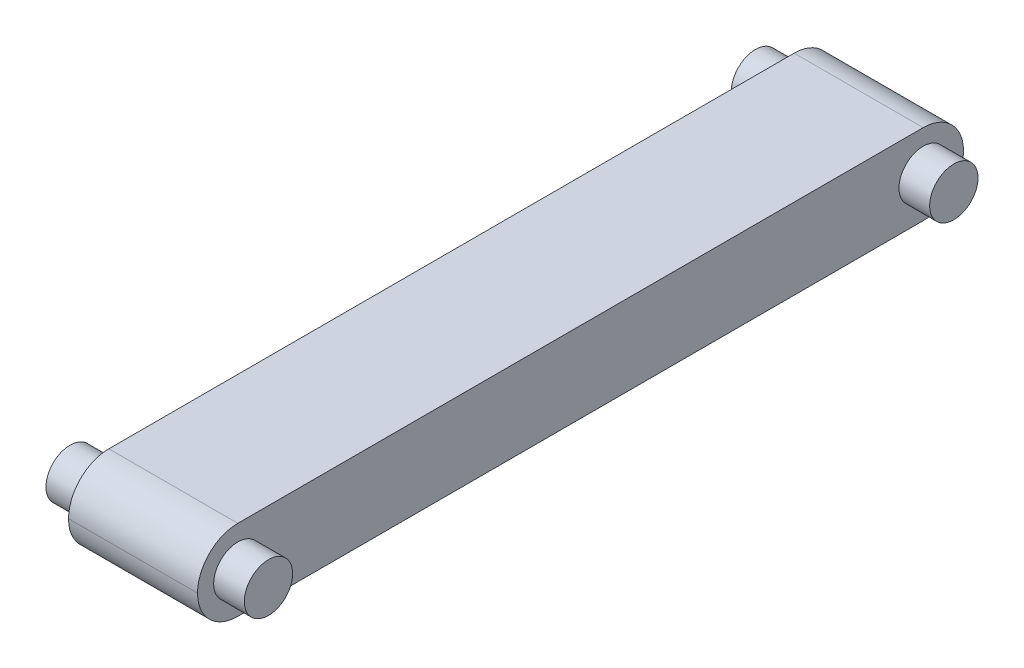
ISO-10303-21;
HEADER;
FILE_DESCRIPTION(('STEP AP214'),'2;1');
FILE_NAME('part.step','',(''),(''),'','','');
FILE_SCHEMA(('AUTOMOTIVE_DESIGN { 1 0 10303 214 1 1 1 1 }'));
ENDSEC;
DATA;
#1=APPLICATION_CONTEXT('core data for automotive mechanical design processes');
#2=APPLICATION_PROTOCOL_DEFINITION('international standard','automotive_design',2000,#1);
#3=PRODUCT_CONTEXT('',#1,'mechanical');
#4=PRODUCT('Part','Part','',(#3));
#5=PRODUCT_RELATED_PRODUCT_CATEGORY('part','',(#4));
#6=PRODUCT_DEFINITION_FORMATION('','',#4);
#7=PRODUCT_DEFINITION_CONTEXT('part definition',#1,'design');
#8=PRODUCT_DEFINITION('design','',#6,#7);
#9=PRODUCT_DEFINITION_SHAPE('','',#8);
#10=(LENGTH_UNIT() NAMED_UNIT(*) SI_UNIT(.MILLI.,.METRE.));
#11=(NAMED_UNIT(*) PLANE_ANGLE_UNIT() SI_UNIT($,.RADIAN.));
#12=(NAMED_UNIT(*) SI_UNIT($,.STERADIAN.) SOLID_ANGLE_UNIT());
#13=UNCERTAINTY_MEASURE_WITH_UNIT(LENGTH_MEASURE(1.E-05),#10,'distance_accuracy_value','');
#14=(GEOMETRIC_REPRESENTATION_CONTEXT(3) GLOBAL_UNCERTAINTY_ASSIGNED_CONTEXT((#13)) GLOBAL_UNIT_ASSIGNED_CONTEXT((#10,
#11,#12)) REPRESENTATION_CONTEXT('',''));
#15=CARTESIAN_POINT('',(0.,0.,0.));
#16=DIRECTION('',(0.,0.,1.));
#17=DIRECTION('',(1.,0.,0.));
#18=AXIS2_PLACEMENT_3D('',#15,#16,#17);
#19=CARTESIAN_POINT('',(0.,5.,0.));
#20=DIRECTION('',(1.,0.,0.));
#21=DIRECTION('',(0.,0.,-1.));
#22=AXIS2_PLACEMENT_3D('',#19,#20,#21);
#23=PLANE('',#22);
#24=CARTESIAN_POINT('',(0.,2.5,-45.));
#25=DIRECTION('',(1.,0.,0.));
#26=DIRECTION('',(0.,0.,-1.));
#27=AXIS2_PLACEMENT_3D('',#24,#25,#26);
#28=CIRCLE('',#27,1.5);
#29=CARTESIAN_POINT('',(0.,2.5,-46.5));
#30=VERTEX_POINT('',#29);
#31=EDGE_CURVE('E147',#30,#30,#28,.T.);
#32=ORIENTED_EDGE('',*,*,#31,.T.);
#33=EDGE_LOOP('',(#32));
#34=FACE_BOUND('',#33,.T.);
#35=CARTESIAN_POINT('',(0.,2.5,-2.5));
#36=DIRECTION('',(1.,0.,0.));
#37=DIRECTION('',(0.,0.,-1.));
#38=AXIS2_PLACEMENT_3D('',#35,#36,#37);
#39=CIRCLE('',#38,1.5);
#40=CARTESIAN_POINT('',(0.,2.5,-4.));
#41=VERTEX_POINT('',#40);
#42=EDGE_CURVE('E110',#41,#41,#39,.T.);
#43=ORIENTED_EDGE('',*,*,#42,.T.);
#44=EDGE_LOOP('',(#43));
#45=FACE_BOUND('',#44,.T.);
#46=CARTESIAN_POINT('',(0.,2.5,-45.));
#47=DIRECTION('',(1.,0.,0.));
#48=DIRECTION('',(0.,0.,-1.));
#49=AXIS2_PLACEMENT_3D('',#46,#47,#48);
#50=CIRCLE('',#49,2.5);
#51=CARTESIAN_POINT('',(0.,5.,-45.));
#52=VERTEX_POINT('',#51);
#53=CARTESIAN_POINT('',(0.,2.5,-47.5));
#54=VERTEX_POINT('',#53);
#55=EDGE_CURVE('E94',#52,#54,#50,.F.);
#56=ORIENTED_EDGE('',*,*,#55,.T.);
#57=CARTESIAN_POINT('',(0.,2.5,-45.));
#58=DIRECTION('',(1.,0.,0.));
#59=DIRECTION('',(0.,0.,-1.));
#60=AXIS2_PLACEMENT_3D('',#57,#58,#59);
#61=CIRCLE('',#60,2.5);
#62=CARTESIAN_POINT('',(0.,0.,-45.));
#63=VERTEX_POINT('',#62);
#64=EDGE_CURVE('E89',#54,#63,#61,.F.);
#65=ORIENTED_EDGE('',*,*,#64,.T.);
#66=DIRECTION('',(0.,0.,1.));
#67=VECTOR('',#66,1.);
#68=CARTESIAN_POINT('',(0.,0.,0.));
#69=LINE('',#68,#67);
#70=CARTESIAN_POINT('',(0.,0.,-2.5));
#71=VERTEX_POINT('',#70);
#72=EDGE_CURVE('E91',#63,#71,#69,.T.);
#73=ORIENTED_EDGE('',*,*,#72,.T.);
#74=CARTESIAN_POINT('',(0.,2.5,-2.5));
#75=DIRECTION('',(1.,0.,0.));
#76=DIRECTION('',(0.,0.,-1.));
#77=AXIS2_PLACEMENT_3D('',#74,#75,#76);
#78=CIRCLE('',#77,2.5);
#79=CARTESIAN_POINT('',(0.,2.5,0.));
#80=VERTEX_POINT('',#79);
#81=EDGE_CURVE('E131',#71,#80,#78,.F.);
#82=ORIENTED_EDGE('',*,*,#81,.T.);
#83=CARTESIAN_POINT('',(0.,2.5,-2.5));
#84=DIRECTION('',(1.,0.,0.));
#85=DIRECTION('',(0.,0.,-1.));
#86=AXIS2_PLACEMENT_3D('',#83,#84,#85);
#87=CIRCLE('',#86,2.5);
#88=CARTESIAN_POINT('',(0.,5.,-2.5));
#89=VERTEX_POINT('',#88);
#90=EDGE_CURVE('E135',#80,#89,#87,.F.);
#91=ORIENTED_EDGE('',*,*,#90,.T.);
#92=DIRECTION('',(0.,0.,1.));
#93=VECTOR('',#92,1.);
#94=CARTESIAN_POINT('',(0.,5.,0.));
#95=LINE('',#94,#93);
#96=EDGE_CURVE('E140',#52,#89,#95,.T.);
#97=ORIENTED_EDGE('',*,*,#96,.F.);
#98=EDGE_LOOP('',(#56,#65,#73,#82,#91,#97));
#99=FACE_BOUND('',#98,.T.);
#100=ADVANCED_FACE('F35',(#34,#45,#99),#23,.F.);
#101=CARTESIAN_POINT('',(8.,5.,0.));
#102=DIRECTION('',(-1.,0.,0.));
#103=DIRECTION('',(0.,0.,1.));
#104=AXIS2_PLACEMENT_3D('',#101,#102,#103);
#105=PLANE('',#104);
#106=CARTESIAN_POINT('',(8.,2.5,-45.));
#107=DIRECTION('',(-1.,0.,0.));
#108=DIRECTION('',(0.,0.,1.));
#109=AXIS2_PLACEMENT_3D('',#106,#107,#108);
#110=CIRCLE('',#109,1.5);
#111=CARTESIAN_POINT('',(8.,2.5,-43.5));
#112=VERTEX_POINT('',#111);
#113=EDGE_CURVE('E143',#112,#112,#110,.T.);
#114=ORIENTED_EDGE('',*,*,#113,.T.);
#115=EDGE_LOOP('',(#114));
#116=FACE_BOUND('',#115,.T.);
#117=CARTESIAN_POINT('',(8.,2.5,-2.5));
#118=DIRECTION('',(-1.,0.,0.));
#119=DIRECTION('',(0.,0.,1.));
#120=AXIS2_PLACEMENT_3D('',#117,#118,#119);
#121=CIRCLE('',#120,1.5);
#122=CARTESIAN_POINT('',(8.,2.5,-1.));
#123=VERTEX_POINT('',#122);
#124=EDGE_CURVE('E148',#123,#123,#121,.T.);
#125=ORIENTED_EDGE('',*,*,#124,.T.);
#126=EDGE_LOOP('',(#125));
#127=FACE_BOUND('',#126,.T.);
#128=DIRECTION('',(0.,0.,-1.));
#129=VECTOR('',#128,1.);
#130=CARTESIAN_POINT('',(8.,0.,0.));
#131=LINE('',#130,#129);
#132=CARTESIAN_POINT('',(8.,0.,-2.5));
#133=VERTEX_POINT('',#132);
#134=CARTESIAN_POINT('',(8.,0.,-45.));
#135=VERTEX_POINT('',#134);
#136=EDGE_CURVE('E109',#133,#135,#131,.T.);
#137=ORIENTED_EDGE('',*,*,#136,.T.);
#138=CARTESIAN_POINT('',(8.,2.5,-45.));
#139=DIRECTION('',(-1.,0.,0.));
#140=DIRECTION('',(0.,0.,1.));
#141=AXIS2_PLACEMENT_3D('',#138,#139,#140);
#142=CIRCLE('',#141,2.5);
#143=CARTESIAN_POINT('',(8.,2.5,-47.5));
#144=VERTEX_POINT('',#143);
#145=EDGE_CURVE('E113',#135,#144,#142,.F.);
#146=ORIENTED_EDGE('',*,*,#145,.T.);
#147=CARTESIAN_POINT('',(8.,2.5,-45.));
#148=DIRECTION('',(-1.,0.,0.));
#149=DIRECTION('',(0.,0.,1.));
#150=AXIS2_PLACEMENT_3D('',#147,#148,#149);
#151=CIRCLE('',#150,2.5);
#152=CARTESIAN_POINT('',(8.,5.,-45.));
#153=VERTEX_POINT('',#152);
#154=EDGE_CURVE('E58',#144,#153,#151,.F.);
#155=ORIENTED_EDGE('',*,*,#154,.T.);
#156=DIRECTION('',(0.,0.,-1.));
#157=VECTOR('',#156,1.);
#158=CARTESIAN_POINT('',(8.,5.,0.));
#159=LINE('',#158,#157);
#160=CARTESIAN_POINT('',(8.,5.,-2.5));
#161=VERTEX_POINT('',#160);
#162=EDGE_CURVE('E137',#161,#153,#159,.T.);
#163=ORIENTED_EDGE('',*,*,#162,.F.);
#164=CARTESIAN_POINT('',(8.,2.5,-2.5));
#165=DIRECTION('',(-1.,0.,0.));
#166=DIRECTION('',(0.,0.,1.));
#167=AXIS2_PLACEMENT_3D('',#164,#165,#166);
#168=CIRCLE('',#167,2.5);
#169=CARTESIAN_POINT('',(8.,2.5,0.));
#170=VERTEX_POINT('',#169);
#171=EDGE_CURVE('E52',#161,#170,#168,.F.);
#172=ORIENTED_EDGE('',*,*,#171,.T.);
#173=CARTESIAN_POINT('',(8.,2.5,-2.5));
#174=DIRECTION('',(-1.,0.,0.));
#175=DIRECTION('',(0.,0.,1.));
#176=AXIS2_PLACEMENT_3D('',#173,#174,#175);
#177=CIRCLE('',#176,2.5);
#178=EDGE_CURVE('E115',#170,#133,#177,.F.);
#179=ORIENTED_EDGE('',*,*,#178,.T.);
#180=EDGE_LOOP('',(#137,#146,#155,#163,#172,#179));
#181=FACE_BOUND('',#180,.T.);
#182=ADVANCED_FACE('F183',(#116,#127,#181),#105,.F.);
#183=CARTESIAN_POINT('',(0.,5.,0.));
#184=DIRECTION('',(0.,-1.,0.));
#185=DIRECTION('',(0.,0.,-1.));
#186=AXIS2_PLACEMENT_3D('',#183,#184,#185);
#187=PLANE('',#186);
#188=ORIENTED_EDGE('',*,*,#162,.T.);
#189=DIRECTION('',(-1.,0.,0.));
#190=VECTOR('',#189,1.);
#191=CARTESIAN_POINT('',(0.,5.,-45.));
#192=LINE('',#191,#190);
#193=EDGE_CURVE('E11',#153,#52,#192,.T.);
#194=ORIENTED_EDGE('',*,*,#193,.T.);
#195=ORIENTED_EDGE('',*,*,#96,.T.);
#196=DIRECTION('',(1.,0.,0.));
#197=VECTOR('',#196,1.);
#198=CARTESIAN_POINT('',(0.,5.,-2.5));
#199=LINE('',#198,#197);
#200=EDGE_CURVE('E44',#89,#161,#199,.T.);
#201=ORIENTED_EDGE('',*,*,#200,.T.);
#202=EDGE_LOOP('',(#188,#194,#195,#201));
#203=FACE_BOUND('',#202,.T.);
#204=ADVANCED_FACE('F189',(#203),#187,.F.);
#205=CARTESIAN_POINT('',(0.,0.,0.));
#206=DIRECTION('',(0.,-1.,0.));
#207=DIRECTION('',(0.,0.,-1.));
#208=AXIS2_PLACEMENT_3D('',#205,#206,#207);
#209=PLANE('',#208);
#210=ORIENTED_EDGE('',*,*,#72,.F.);
#211=DIRECTION('',(-1.,0.,0.));
#212=VECTOR('',#211,1.);
#213=CARTESIAN_POINT('',(8.,0.,-45.));
#214=LINE('',#213,#212);
#215=EDGE_CURVE('E106',#63,#135,#214,.F.);
#216=ORIENTED_EDGE('',*,*,#215,.T.);
#217=ORIENTED_EDGE('',*,*,#136,.F.);
#218=DIRECTION('',(1.,0.,0.));
#219=VECTOR('',#218,1.);
#220=CARTESIAN_POINT('',(0.,0.,-2.5));
#221=LINE('',#220,#219);
#222=EDGE_CURVE('E99',#133,#71,#221,.F.);
#223=ORIENTED_EDGE('',*,*,#222,.T.);
#224=EDGE_LOOP('',(#210,#216,#217,#223));
#225=FACE_BOUND('',#224,.T.);
#226=ADVANCED_FACE('F104',(#225),#209,.T.);
#227=CARTESIAN_POINT('',(9.9,2.5,-2.5));
#228=DIRECTION('',(1.,0.,0.));
#229=DIRECTION('',(0.,0.,-1.));
#230=AXIS2_PLACEMENT_3D('',#227,#228,#229);
#231=PLANE('',#230);
#232=CARTESIAN_POINT('',(9.9,2.5,-2.5));
#233=DIRECTION('',(1.,0.,0.));
#234=DIRECTION('',(0.,0.,-1.));
#235=AXIS2_PLACEMENT_3D('',#232,#233,#234);
#236=CIRCLE('',#235,1.5);
#237=CARTESIAN_POINT('',(9.9,2.5,-4.));
#238=VERTEX_POINT('',#237);
#239=EDGE_CURVE('E158',#238,#238,#236,.T.);
#240=ORIENTED_EDGE('',*,*,#239,.T.);
#241=EDGE_LOOP('',(#240));
#242=FACE_BOUND('',#241,.T.);
#243=ADVANCED_FACE('F220',(#242),#231,.T.);
#244=CARTESIAN_POINT('',(-2.4,2.5,-2.5));
#245=DIRECTION('',(1.,0.,0.));
#246=DIRECTION('',(0.,0.,-1.));
#247=AXIS2_PLACEMENT_3D('',#244,#245,#246);
#248=CYLINDRICAL_SURFACE('',#247,1.5);
#249=ORIENTED_EDGE('',*,*,#239,.F.);
#250=EDGE_LOOP('',(#249));
#251=FACE_BOUND('',#250,.T.);
#252=ORIENTED_EDGE('',*,*,#124,.F.);
#253=EDGE_LOOP('',(#252));
#254=FACE_BOUND('',#253,.T.);
#255=ADVANCED_FACE('F286',(#251,#254),#248,.T.);
#256=CARTESIAN_POINT('',(-2.4,2.5,-2.5));
#257=DIRECTION('',(1.,0.,0.));
#258=DIRECTION('',(0.,0.,-1.));
#259=AXIS2_PLACEMENT_3D('',#256,#257,#258);
#260=CIRCLE('',#259,1.5);
#261=CARTESIAN_POINT('',(-2.4,2.5,-4.));
#262=VERTEX_POINT('',#261);
#263=EDGE_CURVE('E151',#262,#262,#260,.T.);
#264=ORIENTED_EDGE('',*,*,#263,.T.);
#265=EDGE_LOOP('',(#264));
#266=FACE_BOUND('',#265,.T.);
#267=ORIENTED_EDGE('',*,*,#42,.F.);
#268=EDGE_LOOP('',(#267));
#269=FACE_BOUND('',#268,.T.);
#270=ADVANCED_FACE('F276',(#266,#269),#248,.T.);
#271=CARTESIAN_POINT('',(-2.4,2.5,-2.5));
#272=DIRECTION('',(1.,0.,0.));
#273=DIRECTION('',(0.,0.,-1.));
#274=AXIS2_PLACEMENT_3D('',#271,#272,#273);
#275=PLANE('',#274);
#276=ORIENTED_EDGE('',*,*,#263,.F.);
#277=EDGE_LOOP('',(#276));
#278=FACE_BOUND('',#277,.T.);
#279=ADVANCED_FACE('F267',(#278),#275,.F.);
#280=CARTESIAN_POINT('',(9.9,2.5,-45.));
#281=DIRECTION('',(1.,0.,0.));
#282=DIRECTION('',(0.,0.,-1.));
#283=AXIS2_PLACEMENT_3D('',#280,#281,#282);
#284=PLANE('',#283);
#285=CARTESIAN_POINT('',(9.9,2.5,-45.));
#286=DIRECTION('',(1.,0.,0.));
#287=DIRECTION('',(0.,0.,-1.));
#288=AXIS2_PLACEMENT_3D('',#285,#286,#287);
#289=CIRCLE('',#288,1.5);
#290=CARTESIAN_POINT('',(9.9,2.5,-46.5));
#291=VERTEX_POINT('',#290);
#292=EDGE_CURVE('E123',#291,#291,#289,.T.);
#293=ORIENTED_EDGE('',*,*,#292,.T.);
#294=EDGE_LOOP('',(#293));
#295=FACE_BOUND('',#294,.T.);
#296=ADVANCED_FACE('F258',(#295),#284,.T.);
#297=CARTESIAN_POINT('',(-2.4,2.5,-45.));
#298=DIRECTION('',(1.,0.,0.));
#299=DIRECTION('',(0.,0.,-1.));
#300=AXIS2_PLACEMENT_3D('',#297,#298,#299);
#301=CYLINDRICAL_SURFACE('',#300,1.5);
#302=ORIENTED_EDGE('',*,*,#292,.F.);
#303=EDGE_LOOP('',(#302));
#304=FACE_BOUND('',#303,.T.);
#305=ORIENTED_EDGE('',*,*,#113,.F.);
#306=EDGE_LOOP('',(#305));
#307=FACE_BOUND('',#306,.T.);
#308=ADVANCED_FACE('F179',(#304,#307),#301,.T.);
#309=CARTESIAN_POINT('',(-2.4,2.5,-45.));
#310=DIRECTION('',(1.,0.,0.));
#311=DIRECTION('',(0.,0.,-1.));
#312=AXIS2_PLACEMENT_3D('',#309,#310,#311);
#313=CIRCLE('',#312,1.5);
#314=CARTESIAN_POINT('',(-2.4,2.5,-46.5));
#315=VERTEX_POINT('',#314);
#316=EDGE_CURVE('E125',#315,#315,#313,.T.);
#317=ORIENTED_EDGE('',*,*,#316,.T.);
#318=EDGE_LOOP('',(#317));
#319=FACE_BOUND('',#318,.T.);
#320=ORIENTED_EDGE('',*,*,#31,.F.);
#321=EDGE_LOOP('',(#320));
#322=FACE_BOUND('',#321,.T.);
#323=ADVANCED_FACE('F166',(#319,#322),#301,.T.);
#324=CARTESIAN_POINT('',(-2.4,2.5,-45.));
#325=DIRECTION('',(1.,0.,0.));
#326=DIRECTION('',(0.,0.,-1.));
#327=AXIS2_PLACEMENT_3D('',#324,#325,#326);
#328=PLANE('',#327);
#329=ORIENTED_EDGE('',*,*,#316,.F.);
#330=EDGE_LOOP('',(#329));
#331=FACE_BOUND('',#330,.T.);
#332=ADVANCED_FACE('F169',(#331),#328,.F.);
#333=CARTESIAN_POINT('',(0.,2.5,-45.));
#334=DIRECTION('',(-1.,0.,0.));
#335=DIRECTION('',(0.,0.,1.));
#336=AXIS2_PLACEMENT_3D('',#333,#334,#335);
#337=CYLINDRICAL_SURFACE('',#336,2.5);
#338=ORIENTED_EDGE('',*,*,#193,.F.);
#339=ORIENTED_EDGE('',*,*,#154,.F.);
#340=DIRECTION('',(-1.,0.,0.));
#341=VECTOR('',#340,1.);
#342=CARTESIAN_POINT('',(0.,2.5,-47.5));
#343=LINE('',#342,#341);
#344=EDGE_CURVE('E122',#54,#144,#343,.F.);
#345=ORIENTED_EDGE('',*,*,#344,.F.);
#346=ORIENTED_EDGE('',*,*,#55,.F.);
#347=EDGE_LOOP('',(#338,#339,#345,#346));
#348=FACE_BOUND('',#347,.T.);
#349=ADVANCED_FACE('F171',(#348),#337,.T.);
#350=CARTESIAN_POINT('',(0.,2.5,-45.));
#351=DIRECTION('',(1.,0.,0.));
#352=DIRECTION('',(0.,0.,-1.));
#353=AXIS2_PLACEMENT_3D('',#350,#351,#352);
#354=CYLINDRICAL_SURFACE('',#353,2.5);
#355=ORIENTED_EDGE('',*,*,#145,.F.);
#356=ORIENTED_EDGE('',*,*,#215,.F.);
#357=ORIENTED_EDGE('',*,*,#64,.F.);
#358=ORIENTED_EDGE('',*,*,#344,.T.);
#359=EDGE_LOOP('',(#355,#356,#357,#358));
#360=FACE_BOUND('',#359,.T.);
#361=ADVANCED_FACE('F112',(#360),#354,.T.);
#362=CARTESIAN_POINT('',(0.,2.5,-2.5));
#363=DIRECTION('',(1.,0.,0.));
#364=DIRECTION('',(0.,0.,-1.));
#365=AXIS2_PLACEMENT_3D('',#362,#363,#364);
#366=CYLINDRICAL_SURFACE('',#365,2.5);
#367=ORIENTED_EDGE('',*,*,#200,.F.);
#368=ORIENTED_EDGE('',*,*,#90,.F.);
#369=DIRECTION('',(1.,0.,0.));
#370=VECTOR('',#369,1.);
#371=CARTESIAN_POINT('',(0.,2.5,0.));
#372=LINE('',#371,#370);
#373=EDGE_CURVE('E39',#170,#80,#372,.F.);
#374=ORIENTED_EDGE('',*,*,#373,.F.);
#375=ORIENTED_EDGE('',*,*,#171,.F.);
#376=EDGE_LOOP('',(#367,#368,#374,#375));
#377=FACE_BOUND('',#376,.T.);
#378=ADVANCED_FACE('F37',(#377),#366,.T.);
#379=CARTESIAN_POINT('',(0.,2.5,-2.5));
#380=DIRECTION('',(-1.,0.,0.));
#381=DIRECTION('',(0.,0.,1.));
#382=AXIS2_PLACEMENT_3D('',#379,#380,#381);
#383=CYLINDRICAL_SURFACE('',#382,2.5);
#384=ORIENTED_EDGE('',*,*,#81,.F.);
#385=ORIENTED_EDGE('',*,*,#222,.F.);
#386=ORIENTED_EDGE('',*,*,#178,.F.);
#387=ORIENTED_EDGE('',*,*,#373,.T.);
#388=EDGE_LOOP('',(#384,#385,#386,#387));
#389=FACE_BOUND('',#388,.T.);
#390=ADVANCED_FACE('F130',(#389),#383,.T.);
#391=CLOSED_SHELL('',(#100,#182,#204,#226,#243,#255,#270,#279,#296,#308,#323,#332,#349,#361,
#378,#390));
#392=MANIFOLD_SOLID_BREP('B2',#391);
#393=ADVANCED_BREP_SHAPE_REPRESENTATION('',(#18,#392),#14);
#394=SHAPE_DEFINITION_REPRESENTATION(#9,#393);
ENDSEC;
END-ISO-10303-21;
